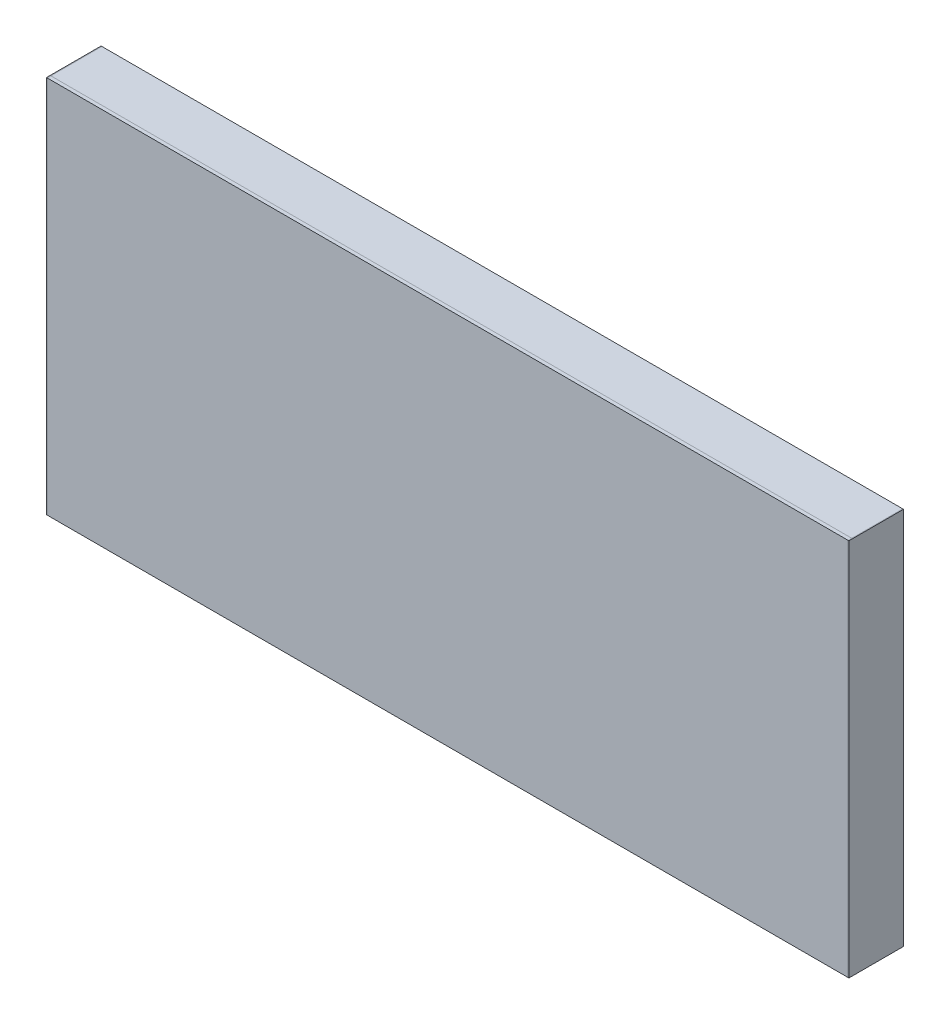
ISO-10303-21;
HEADER;
FILE_DESCRIPTION(('STEP AP214'),'2;1');
FILE_NAME('part.step','',(''),(''),'','','');
FILE_SCHEMA(('AUTOMOTIVE_DESIGN { 1 0 10303 214 1 1 1 1 }'));
ENDSEC;
DATA;
#1=APPLICATION_CONTEXT('core data for automotive mechanical design processes');
#2=APPLICATION_PROTOCOL_DEFINITION('international standard','automotive_design',2000,#1);
#3=PRODUCT_CONTEXT('',#1,'mechanical');
#4=PRODUCT('Part','Part','',(#3));
#5=PRODUCT_RELATED_PRODUCT_CATEGORY('part','',(#4));
#6=PRODUCT_DEFINITION_FORMATION('','',#4);
#7=PRODUCT_DEFINITION_CONTEXT('part definition',#1,'design');
#8=PRODUCT_DEFINITION('design','',#6,#7);
#9=PRODUCT_DEFINITION_SHAPE('','',#8);
#10=(LENGTH_UNIT() NAMED_UNIT(*) SI_UNIT(.MILLI.,.METRE.));
#11=(NAMED_UNIT(*) PLANE_ANGLE_UNIT() SI_UNIT($,.RADIAN.));
#12=(NAMED_UNIT(*) SI_UNIT($,.STERADIAN.) SOLID_ANGLE_UNIT());
#13=UNCERTAINTY_MEASURE_WITH_UNIT(LENGTH_MEASURE(1.E-05),#10,'distance_accuracy_value','');
#14=(GEOMETRIC_REPRESENTATION_CONTEXT(3) GLOBAL_UNCERTAINTY_ASSIGNED_CONTEXT((#13)) GLOBAL_UNIT_ASSIGNED_CONTEXT((#10,
#11,#12)) REPRESENTATION_CONTEXT('',''));
#15=CARTESIAN_POINT('',(0.,0.,0.));
#16=DIRECTION('',(0.,0.,1.));
#17=DIRECTION('',(1.,0.,0.));
#18=AXIS2_PLACEMENT_3D('',#15,#16,#17);
#19=CARTESIAN_POINT('',(-330.6,132.,-42.));
#20=DIRECTION('',(0.,0.,1.));
#21=DIRECTION('',(-1.,0.,0.));
#22=AXIS2_PLACEMENT_3D('',#19,#20,#21);
#23=PLANE('',#22);
#24=DIRECTION('',(0.,1.,0.));
#25=VECTOR('',#24,1.);
#26=CARTESIAN_POINT('',(-330.,132.,-42.));
#27=LINE('',#26,#25);
#28=CARTESIAN_POINT('',(-330.,-156.,-42.));
#29=VERTEX_POINT('',#28);
#30=CARTESIAN_POINT('',(-330.,156.,-42.));
#31=VERTEX_POINT('',#30);
#32=EDGE_CURVE('E114',#29,#31,#27,.T.);
#33=ORIENTED_EDGE('',*,*,#32,.F.);
#34=DIRECTION('',(1.,0.,0.));
#35=VECTOR('',#34,1.);
#36=CARTESIAN_POINT('',(-330.6,-156.,-42.));
#37=LINE('',#36,#35);
#38=CARTESIAN_POINT('',(-330.6,-156.,-42.));
#39=VERTEX_POINT('',#38);
#40=EDGE_CURVE('E112',#39,#29,#37,.T.);
#41=ORIENTED_EDGE('',*,*,#40,.F.);
#42=DIRECTION('',(0.,1.,0.));
#43=VECTOR('',#42,1.);
#44=CARTESIAN_POINT('',(-330.6,-156.,-42.));
#45=LINE('',#44,#43);
#46=CARTESIAN_POINT('',(-330.6,156.,-42.));
#47=VERTEX_POINT('',#46);
#48=EDGE_CURVE('E107',#39,#47,#45,.T.);
#49=ORIENTED_EDGE('',*,*,#48,.T.);
#50=DIRECTION('',(1.,0.,0.));
#51=VECTOR('',#50,1.);
#52=CARTESIAN_POINT('',(-330.6,156.,-42.));
#53=LINE('',#52,#51);
#54=EDGE_CURVE('E12',#47,#31,#53,.T.);
#55=ORIENTED_EDGE('',*,*,#54,.T.);
#56=EDGE_LOOP('',(#33,#41,#49,#55));
#57=FACE_BOUND('',#56,.T.);
#58=ADVANCED_FACE('F55',(#57),#23,.F.);
#59=CARTESIAN_POINT('',(-330.6,156.,3.));
#60=DIRECTION('',(0.,1.,0.));
#61=DIRECTION('',(0.,0.,1.));
#62=AXIS2_PLACEMENT_3D('',#59,#60,#61);
#63=PLANE('',#62);
#64=DIRECTION('',(0.,0.,-1.));
#65=VECTOR('',#64,1.);
#66=CARTESIAN_POINT('',(-330.,156.,3.));
#67=LINE('',#66,#65);
#68=CARTESIAN_POINT('',(-330.,156.,3.));
#69=VERTEX_POINT('',#68);
#70=EDGE_CURVE('E120',#69,#31,#67,.T.);
#71=ORIENTED_EDGE('',*,*,#70,.T.);
#72=ORIENTED_EDGE('',*,*,#54,.F.);
#73=DIRECTION('',(0.,0.,-1.));
#74=VECTOR('',#73,1.);
#75=CARTESIAN_POINT('',(-330.6,156.,0.));
#76=LINE('',#75,#74);
#77=CARTESIAN_POINT('',(-330.6,156.,3.));
#78=VERTEX_POINT('',#77);
#79=EDGE_CURVE('E93',#78,#47,#76,.T.);
#80=ORIENTED_EDGE('',*,*,#79,.F.);
#81=DIRECTION('',(1.,0.,0.));
#82=VECTOR('',#81,1.);
#83=CARTESIAN_POINT('',(-330.6,156.,3.));
#84=LINE('',#83,#82);
#85=EDGE_CURVE('E58',#78,#69,#84,.T.);
#86=ORIENTED_EDGE('',*,*,#85,.T.);
#87=EDGE_LOOP('',(#71,#72,#80,#86));
#88=FACE_BOUND('',#87,.T.);
#89=ADVANCED_FACE('F110',(#88),#63,.T.);
#90=CARTESIAN_POINT('',(-330.6,-156.,3.));
#91=DIRECTION('',(0.,0.,1.));
#92=DIRECTION('',(-1.,0.,0.));
#93=AXIS2_PLACEMENT_3D('',#90,#91,#92);
#94=PLANE('',#93);
#95=DIRECTION('',(0.,1.,0.));
#96=VECTOR('',#95,1.);
#97=CARTESIAN_POINT('',(-330.,-156.,3.));
#98=LINE('',#97,#96);
#99=CARTESIAN_POINT('',(-330.,-156.,3.));
#100=VERTEX_POINT('',#99);
#101=EDGE_CURVE('E101',#100,#69,#98,.T.);
#102=ORIENTED_EDGE('',*,*,#101,.T.);
#103=ORIENTED_EDGE('',*,*,#85,.F.);
#104=DIRECTION('',(0.,1.,0.));
#105=VECTOR('',#104,1.);
#106=CARTESIAN_POINT('',(-330.6,-156.,3.));
#107=LINE('',#106,#105);
#108=CARTESIAN_POINT('',(-330.6,-156.,3.));
#109=VERTEX_POINT('',#108);
#110=EDGE_CURVE('E98',#109,#78,#107,.T.);
#111=ORIENTED_EDGE('',*,*,#110,.F.);
#112=DIRECTION('',(1.,0.,0.));
#113=VECTOR('',#112,1.);
#114=CARTESIAN_POINT('',(-330.6,-156.,3.));
#115=LINE('',#114,#113);
#116=EDGE_CURVE('E106',#109,#100,#115,.T.);
#117=ORIENTED_EDGE('',*,*,#116,.T.);
#118=EDGE_LOOP('',(#102,#103,#111,#117));
#119=FACE_BOUND('',#118,.T.);
#120=ADVANCED_FACE('F105',(#119),#94,.T.);
#121=CARTESIAN_POINT('',(-330.6,-156.,3.));
#122=DIRECTION('',(0.,1.,0.));
#123=DIRECTION('',(0.,0.,1.));
#124=AXIS2_PLACEMENT_3D('',#121,#122,#123);
#125=PLANE('',#124);
#126=DIRECTION('',(0.,0.,-1.));
#127=VECTOR('',#126,1.);
#128=CARTESIAN_POINT('',(-330.,-156.,3.));
#129=LINE('',#128,#127);
#130=EDGE_CURVE('E81',#100,#29,#129,.T.);
#131=ORIENTED_EDGE('',*,*,#130,.F.);
#132=ORIENTED_EDGE('',*,*,#116,.F.);
#133=DIRECTION('',(0.,0.,-1.));
#134=VECTOR('',#133,1.);
#135=CARTESIAN_POINT('',(-330.6,-156.,3.));
#136=LINE('',#135,#134);
#137=EDGE_CURVE('E67',#109,#39,#136,.T.);
#138=ORIENTED_EDGE('',*,*,#137,.T.);
#139=ORIENTED_EDGE('',*,*,#40,.T.);
#140=EDGE_LOOP('',(#131,#132,#138,#139));
#141=FACE_BOUND('',#140,.T.);
#142=ADVANCED_FACE('F129',(#141),#125,.F.);
#143=CARTESIAN_POINT('',(-330.6,0.,0.));
#144=DIRECTION('',(1.,0.,0.));
#145=DIRECTION('',(0.,0.,1.));
#146=AXIS2_PLACEMENT_3D('',#143,#144,#145);
#147=PLANE('',#146);
#148=ORIENTED_EDGE('',*,*,#48,.F.);
#149=ORIENTED_EDGE('',*,*,#137,.F.);
#150=ORIENTED_EDGE('',*,*,#110,.T.);
#151=ORIENTED_EDGE('',*,*,#79,.T.);
#152=EDGE_LOOP('',(#148,#149,#150,#151));
#153=FACE_BOUND('',#152,.T.);
#154=ADVANCED_FACE('F96',(#153),#147,.F.);
#155=CARTESIAN_POINT('',(-330.,0.,0.));
#156=DIRECTION('',(1.,0.,0.));
#157=DIRECTION('',(0.,0.,1.));
#158=AXIS2_PLACEMENT_3D('',#155,#156,#157);
#159=PLANE('',#158);
#160=ORIENTED_EDGE('',*,*,#32,.T.);
#161=ORIENTED_EDGE('',*,*,#70,.F.);
#162=ORIENTED_EDGE('',*,*,#101,.F.);
#163=ORIENTED_EDGE('',*,*,#130,.T.);
#164=EDGE_LOOP('',(#160,#161,#162,#163));
#165=FACE_BOUND('',#164,.T.);
#166=ADVANCED_FACE('F125',(#165),#159,.T.);
#167=CLOSED_SHELL('',(#58,#89,#120,#142,#154,#166));
#168=MANIFOLD_SOLID_BREP('B2',#167);
#169=CARTESIAN_POINT('',(330.,-156.,3.));
#170=DIRECTION('',(-1.,0.,0.));
#171=DIRECTION('',(0.,0.,1.));
#172=AXIS2_PLACEMENT_3D('',#169,#170,#171);
#173=PLANE('',#172);
#174=DIRECTION('',(0.,0.,-1.));
#175=VECTOR('',#174,1.);
#176=CARTESIAN_POINT('',(330.,-156.,3.));
#177=LINE('',#176,#175);
#178=CARTESIAN_POINT('',(330.,-156.,3.));
#179=VERTEX_POINT('',#178);
#180=CARTESIAN_POINT('',(330.,-156.,-42.));
#181=VERTEX_POINT('',#180);
#182=EDGE_CURVE('E265',#179,#181,#177,.T.);
#183=ORIENTED_EDGE('',*,*,#182,.T.);
#184=DIRECTION('',(0.,1.,0.));
#185=VECTOR('',#184,1.);
#186=CARTESIAN_POINT('',(330.,-156.,-42.));
#187=LINE('',#186,#185);
#188=CARTESIAN_POINT('',(330.,-132.,-42.));
#189=VERTEX_POINT('',#188);
#190=EDGE_CURVE('E278',#181,#189,#187,.T.);
#191=ORIENTED_EDGE('',*,*,#190,.T.);
#192=DIRECTION('',(0.,0.,-1.));
#193=VECTOR('',#192,1.);
#194=CARTESIAN_POINT('',(330.,-132.,-42.));
#195=LINE('',#194,#193);
#196=CARTESIAN_POINT('',(330.,-132.,-40.8));
#197=VERTEX_POINT('',#196);
#198=EDGE_CURVE('E311',#197,#189,#195,.T.);
#199=ORIENTED_EDGE('',*,*,#198,.F.);
#200=DIRECTION('',(0.,1.,0.));
#201=VECTOR('',#200,1.);
#202=CARTESIAN_POINT('',(330.,-156.,-40.8));
#203=LINE('',#202,#201);
#204=CARTESIAN_POINT('',(330.,-154.8,-40.8));
#205=VERTEX_POINT('',#204);
#206=EDGE_CURVE('E291',#205,#197,#203,.T.);
#207=ORIENTED_EDGE('',*,*,#206,.F.);
#208=DIRECTION('',(0.,0.,-1.));
#209=VECTOR('',#208,1.);
#210=CARTESIAN_POINT('',(330.,-154.8,0.));
#211=LINE('',#210,#209);
#212=CARTESIAN_POINT('',(330.,-154.8,0.));
#213=VERTEX_POINT('',#212);
#214=EDGE_CURVE('E290',#213,#205,#211,.T.);
#215=ORIENTED_EDGE('',*,*,#214,.F.);
#216=DIRECTION('',(0.,1.,0.));
#217=VECTOR('',#216,1.);
#218=CARTESIAN_POINT('',(330.,-156.,0.));
#219=LINE('',#218,#217);
#220=CARTESIAN_POINT('',(330.,156.,0.));
#221=VERTEX_POINT('',#220);
#222=EDGE_CURVE('E313',#213,#221,#219,.T.);
#223=ORIENTED_EDGE('',*,*,#222,.T.);
#224=DIRECTION('',(0.,0.,-1.));
#225=VECTOR('',#224,1.);
#226=CARTESIAN_POINT('',(330.,156.,3.));
#227=LINE('',#226,#225);
#228=CARTESIAN_POINT('',(330.,156.,3.));
#229=VERTEX_POINT('',#228);
#230=EDGE_CURVE('E49',#229,#221,#227,.T.);
#231=ORIENTED_EDGE('',*,*,#230,.F.);
#232=DIRECTION('',(0.,1.,0.));
#233=VECTOR('',#232,1.);
#234=CARTESIAN_POINT('',(330.,-156.,3.));
#235=LINE('',#234,#233);
#236=EDGE_CURVE('E314',#179,#229,#235,.T.);
#237=ORIENTED_EDGE('',*,*,#236,.F.);
#238=EDGE_LOOP('',(#183,#191,#199,#207,#215,#223,#231,#237));
#239=FACE_BOUND('',#238,.T.);
#240=ADVANCED_FACE('F182',(#239),#173,.F.);
#241=CARTESIAN_POINT('',(-330.,156.,3.));
#242=DIRECTION('',(0.,-1.,0.));
#243=DIRECTION('',(0.,0.,-1.));
#244=AXIS2_PLACEMENT_3D('',#241,#242,#243);
#245=PLANE('',#244);
#246=DIRECTION('',(-1.,0.,0.));
#247=VECTOR('',#246,1.);
#248=CARTESIAN_POINT('',(-330.,156.,0.));
#249=LINE('',#248,#247);
#250=CARTESIAN_POINT('',(-330.,156.,0.));
#251=VERTEX_POINT('',#250);
#252=EDGE_CURVE('E223',#221,#251,#249,.T.);
#253=ORIENTED_EDGE('',*,*,#252,.T.);
#254=DIRECTION('',(0.,0.,-1.));
#255=VECTOR('',#254,1.);
#256=CARTESIAN_POINT('',(-330.,156.,3.));
#257=LINE('',#256,#255);
#258=CARTESIAN_POINT('',(-330.,156.,3.));
#259=VERTEX_POINT('',#258);
#260=EDGE_CURVE('E191',#259,#251,#257,.T.);
#261=ORIENTED_EDGE('',*,*,#260,.F.);
#262=DIRECTION('',(-1.,0.,0.));
#263=VECTOR('',#262,1.);
#264=CARTESIAN_POINT('',(-330.,156.,3.));
#265=LINE('',#264,#263);
#266=EDGE_CURVE('E226',#229,#259,#265,.T.);
#267=ORIENTED_EDGE('',*,*,#266,.F.);
#268=ORIENTED_EDGE('',*,*,#230,.T.);
#269=EDGE_LOOP('',(#253,#261,#267,#268));
#270=FACE_BOUND('',#269,.T.);
#271=ADVANCED_FACE('F335',(#270),#245,.F.);
#272=CARTESIAN_POINT('',(-330.,-156.,3.));
#273=DIRECTION('',(1.,0.,0.));
#274=DIRECTION('',(0.,0.,-1.));
#275=AXIS2_PLACEMENT_3D('',#272,#273,#274);
#276=PLANE('',#275);
#277=DIRECTION('',(0.,-1.,0.));
#278=VECTOR('',#277,1.);
#279=CARTESIAN_POINT('',(-330.,-156.,0.));
#280=LINE('',#279,#278);
#281=CARTESIAN_POINT('',(-330.,-154.8,0.));
#282=VERTEX_POINT('',#281);
#283=EDGE_CURVE('E320',#251,#282,#280,.T.);
#284=ORIENTED_EDGE('',*,*,#283,.T.);
#285=DIRECTION('',(0.,0.,-1.));
#286=VECTOR('',#285,1.);
#287=CARTESIAN_POINT('',(-330.,-154.8,0.));
#288=LINE('',#287,#286);
#289=CARTESIAN_POINT('',(-330.,-154.8,-40.8));
#290=VERTEX_POINT('',#289);
#291=EDGE_CURVE('E283',#282,#290,#288,.T.);
#292=ORIENTED_EDGE('',*,*,#291,.T.);
#293=DIRECTION('',(0.,1.,0.));
#294=VECTOR('',#293,1.);
#295=CARTESIAN_POINT('',(-330.,-156.,-40.8));
#296=LINE('',#295,#294);
#297=CARTESIAN_POINT('',(-330.,-132.,-40.8));
#298=VERTEX_POINT('',#297);
#299=EDGE_CURVE('E288',#290,#298,#296,.T.);
#300=ORIENTED_EDGE('',*,*,#299,.T.);
#301=DIRECTION('',(0.,0.,-1.));
#302=VECTOR('',#301,1.);
#303=CARTESIAN_POINT('',(-330.,-132.,-42.));
#304=LINE('',#303,#302);
#305=CARTESIAN_POINT('',(-330.,-132.,-42.));
#306=VERTEX_POINT('',#305);
#307=EDGE_CURVE('E266',#298,#306,#304,.T.);
#308=ORIENTED_EDGE('',*,*,#307,.T.);
#309=DIRECTION('',(0.,1.,0.));
#310=VECTOR('',#309,1.);
#311=CARTESIAN_POINT('',(-330.,-156.,-42.));
#312=LINE('',#311,#310);
#313=CARTESIAN_POINT('',(-330.,-156.,-42.));
#314=VERTEX_POINT('',#313);
#315=EDGE_CURVE('E270',#314,#306,#312,.T.);
#316=ORIENTED_EDGE('',*,*,#315,.F.);
#317=DIRECTION('',(0.,0.,-1.));
#318=VECTOR('',#317,1.);
#319=CARTESIAN_POINT('',(-330.,-156.,3.));
#320=LINE('',#319,#318);
#321=CARTESIAN_POINT('',(-330.,-156.,3.));
#322=VERTEX_POINT('',#321);
#323=EDGE_CURVE('E256',#322,#314,#320,.T.);
#324=ORIENTED_EDGE('',*,*,#323,.F.);
#325=DIRECTION('',(0.,-1.,0.));
#326=VECTOR('',#325,1.);
#327=CARTESIAN_POINT('',(-330.,-156.,3.));
#328=LINE('',#327,#326);
#329=EDGE_CURVE('E316',#259,#322,#328,.T.);
#330=ORIENTED_EDGE('',*,*,#329,.F.);
#331=ORIENTED_EDGE('',*,*,#260,.T.);
#332=EDGE_LOOP('',(#284,#292,#300,#308,#316,#324,#330,#331));
#333=FACE_BOUND('',#332,.T.);
#334=ADVANCED_FACE('F268',(#333),#276,.F.);
#335=CARTESIAN_POINT('',(-330.,-156.,3.));
#336=DIRECTION('',(0.,1.,0.));
#337=DIRECTION('',(0.,0.,1.));
#338=AXIS2_PLACEMENT_3D('',#335,#336,#337);
#339=PLANE('',#338);
#340=ORIENTED_EDGE('',*,*,#323,.T.);
#341=DIRECTION('',(1.,0.,0.));
#342=VECTOR('',#341,1.);
#343=CARTESIAN_POINT('',(-330.,-156.,-42.));
#344=LINE('',#343,#342);
#345=EDGE_CURVE('E263',#314,#181,#344,.T.);
#346=ORIENTED_EDGE('',*,*,#345,.T.);
#347=ORIENTED_EDGE('',*,*,#182,.F.);
#348=DIRECTION('',(1.,0.,0.));
#349=VECTOR('',#348,1.);
#350=CARTESIAN_POINT('',(-330.,-156.,3.));
#351=LINE('',#350,#349);
#352=EDGE_CURVE('E206',#322,#179,#351,.T.);
#353=ORIENTED_EDGE('',*,*,#352,.F.);
#354=EDGE_LOOP('',(#340,#346,#347,#353));
#355=FACE_BOUND('',#354,.T.);
#356=ADVANCED_FACE('F258',(#355),#339,.F.);
#357=CARTESIAN_POINT('',(0.,0.,3.));
#358=DIRECTION('',(0.,0.,-1.));
#359=DIRECTION('',(-1.,0.,0.));
#360=AXIS2_PLACEMENT_3D('',#357,#358,#359);
#361=PLANE('',#360);
#362=ORIENTED_EDGE('',*,*,#236,.T.);
#363=ORIENTED_EDGE('',*,*,#266,.T.);
#364=ORIENTED_EDGE('',*,*,#329,.T.);
#365=ORIENTED_EDGE('',*,*,#352,.T.);
#366=EDGE_LOOP('',(#362,#363,#364,#365));
#367=FACE_BOUND('',#366,.T.);
#368=ADVANCED_FACE('F355',(#367),#361,.F.);
#369=CARTESIAN_POINT('',(0.,0.,0.));
#370=DIRECTION('',(0.,0.,-1.));
#371=DIRECTION('',(-1.,0.,0.));
#372=AXIS2_PLACEMENT_3D('',#369,#370,#371);
#373=PLANE('',#372);
#374=DIRECTION('',(1.,0.,0.));
#375=VECTOR('',#374,1.);
#376=CARTESIAN_POINT('',(-330.,-154.8,0.));
#377=LINE('',#376,#375);
#378=EDGE_CURVE('E187',#282,#213,#377,.T.);
#379=ORIENTED_EDGE('',*,*,#378,.F.);
#380=ORIENTED_EDGE('',*,*,#283,.F.);
#381=ORIENTED_EDGE('',*,*,#252,.F.);
#382=ORIENTED_EDGE('',*,*,#222,.F.);
#383=EDGE_LOOP('',(#379,#380,#381,#382));
#384=FACE_BOUND('',#383,.T.);
#385=ADVANCED_FACE('F326',(#384),#373,.T.);
#386=CARTESIAN_POINT('',(-330.,-132.,-42.));
#387=DIRECTION('',(0.,1.,0.));
#388=DIRECTION('',(1.,0.,0.));
#389=AXIS2_PLACEMENT_3D('',#386,#387,#388);
#390=PLANE('',#389);
#391=ORIENTED_EDGE('',*,*,#307,.F.);
#392=DIRECTION('',(-1.,0.,0.));
#393=VECTOR('',#392,1.);
#394=CARTESIAN_POINT('',(-330.,-132.,-40.8));
#395=LINE('',#394,#393);
#396=EDGE_CURVE('E281',#298,#197,#395,.F.);
#397=ORIENTED_EDGE('',*,*,#396,.T.);
#398=ORIENTED_EDGE('',*,*,#198,.T.);
#399=DIRECTION('',(1.,0.,0.));
#400=VECTOR('',#399,1.);
#401=CARTESIAN_POINT('',(-330.,-132.,-42.));
#402=LINE('',#401,#400);
#403=EDGE_CURVE('E274',#306,#189,#402,.T.);
#404=ORIENTED_EDGE('',*,*,#403,.F.);
#405=EDGE_LOOP('',(#391,#397,#398,#404));
#406=FACE_BOUND('',#405,.T.);
#407=ADVANCED_FACE('F343',(#406),#390,.T.);
#408=CARTESIAN_POINT('',(-330.,-156.,-42.));
#409=DIRECTION('',(0.,0.,-1.));
#410=DIRECTION('',(-1.,0.,0.));
#411=AXIS2_PLACEMENT_3D('',#408,#409,#410);
#412=PLANE('',#411);
#413=ORIENTED_EDGE('',*,*,#190,.F.);
#414=ORIENTED_EDGE('',*,*,#345,.F.);
#415=ORIENTED_EDGE('',*,*,#315,.T.);
#416=ORIENTED_EDGE('',*,*,#403,.T.);
#417=EDGE_LOOP('',(#413,#414,#415,#416));
#418=FACE_BOUND('',#417,.T.);
#419=ADVANCED_FACE('F276',(#418),#412,.T.);
#420=CARTESIAN_POINT('',(-330.,-154.8,0.));
#421=DIRECTION('',(0.,-1.,0.));
#422=DIRECTION('',(0.,0.,-1.));
#423=AXIS2_PLACEMENT_3D('',#420,#421,#422);
#424=PLANE('',#423);
#425=ORIENTED_EDGE('',*,*,#214,.T.);
#426=DIRECTION('',(1.,0.,0.));
#427=VECTOR('',#426,1.);
#428=CARTESIAN_POINT('',(-330.,-154.8,-40.8));
#429=LINE('',#428,#427);
#430=EDGE_CURVE('E293',#290,#205,#429,.T.);
#431=ORIENTED_EDGE('',*,*,#430,.F.);
#432=ORIENTED_EDGE('',*,*,#291,.F.);
#433=ORIENTED_EDGE('',*,*,#378,.T.);
#434=EDGE_LOOP('',(#425,#431,#432,#433));
#435=FACE_BOUND('',#434,.T.);
#436=ADVANCED_FACE('F336',(#435),#424,.F.);
#437=CARTESIAN_POINT('',(-330.,-156.,-40.8));
#438=DIRECTION('',(0.,0.,-1.));
#439=DIRECTION('',(-1.,0.,0.));
#440=AXIS2_PLACEMENT_3D('',#437,#438,#439);
#441=PLANE('',#440);
#442=ORIENTED_EDGE('',*,*,#206,.T.);
#443=ORIENTED_EDGE('',*,*,#396,.F.);
#444=ORIENTED_EDGE('',*,*,#299,.F.);
#445=ORIENTED_EDGE('',*,*,#430,.T.);
#446=EDGE_LOOP('',(#442,#443,#444,#445));
#447=FACE_BOUND('',#446,.T.);
#448=ADVANCED_FACE('F341',(#447),#441,.F.);
#449=CLOSED_SHELL('',(#240,#271,#334,#356,#368,#385,#407,#419,#436,#448));
#450=MANIFOLD_SOLID_BREP('B6',#449);
#451=CARTESIAN_POINT('',(330.6,132.,-42.));
#452=DIRECTION('',(0.,0.,1.));
#453=DIRECTION('',(1.,0.,0.));
#454=AXIS2_PLACEMENT_3D('',#451,#452,#453);
#455=PLANE('',#454);
#456=DIRECTION('',(0.,1.,0.));
#457=VECTOR('',#456,1.);
#458=CARTESIAN_POINT('',(330.,132.,-42.));
#459=LINE('',#458,#457);
#460=CARTESIAN_POINT('',(330.,-156.,-42.));
#461=VERTEX_POINT('',#460);
#462=CARTESIAN_POINT('',(330.,156.,-42.));
#463=VERTEX_POINT('',#462);
#464=EDGE_CURVE('E469',#461,#463,#459,.T.);
#465=ORIENTED_EDGE('',*,*,#464,.T.);
#466=DIRECTION('',(-1.,0.,0.));
#467=VECTOR('',#466,1.);
#468=CARTESIAN_POINT('',(330.6,156.,-42.));
#469=LINE('',#468,#467);
#470=CARTESIAN_POINT('',(330.6,156.,-42.));
#471=VERTEX_POINT('',#470);
#472=EDGE_CURVE('E181',#471,#463,#469,.T.);
#473=ORIENTED_EDGE('',*,*,#472,.F.);
#474=DIRECTION('',(0.,1.,0.));
#475=VECTOR('',#474,1.);
#476=CARTESIAN_POINT('',(330.6,-156.,-42.));
#477=LINE('',#476,#475);
#478=CARTESIAN_POINT('',(330.6,-156.,-42.));
#479=VERTEX_POINT('',#478);
#480=EDGE_CURVE('E475',#479,#471,#477,.T.);
#481=ORIENTED_EDGE('',*,*,#480,.F.);
#482=DIRECTION('',(-1.,0.,0.));
#483=VECTOR('',#482,1.);
#484=CARTESIAN_POINT('',(330.6,-156.,-42.));
#485=LINE('',#484,#483);
#486=EDGE_CURVE('E493',#479,#461,#485,.T.);
#487=ORIENTED_EDGE('',*,*,#486,.T.);
#488=EDGE_LOOP('',(#465,#473,#481,#487));
#489=FACE_BOUND('',#488,.T.);
#490=ADVANCED_FACE('F431',(#489),#455,.F.);
#491=CARTESIAN_POINT('',(330.6,156.,3.));
#492=DIRECTION('',(0.,1.,0.));
#493=DIRECTION('',(0.,0.,1.));
#494=AXIS2_PLACEMENT_3D('',#491,#492,#493);
#495=PLANE('',#494);
#496=DIRECTION('',(0.,0.,-1.));
#497=VECTOR('',#496,1.);
#498=CARTESIAN_POINT('',(330.,156.,3.));
#499=LINE('',#498,#497);
#500=CARTESIAN_POINT('',(330.,156.,3.));
#501=VERTEX_POINT('',#500);
#502=EDGE_CURVE('E481',#501,#463,#499,.T.);
#503=ORIENTED_EDGE('',*,*,#502,.F.);
#504=DIRECTION('',(-1.,0.,0.));
#505=VECTOR('',#504,1.);
#506=CARTESIAN_POINT('',(330.6,156.,3.));
#507=LINE('',#506,#505);
#508=CARTESIAN_POINT('',(330.6,156.,3.));
#509=VERTEX_POINT('',#508);
#510=EDGE_CURVE('E437',#509,#501,#507,.T.);
#511=ORIENTED_EDGE('',*,*,#510,.F.);
#512=DIRECTION('',(0.,0.,-1.));
#513=VECTOR('',#512,1.);
#514=CARTESIAN_POINT('',(330.6,156.,0.));
#515=LINE('',#514,#513);
#516=EDGE_CURVE('E478',#509,#471,#515,.T.);
#517=ORIENTED_EDGE('',*,*,#516,.T.);
#518=ORIENTED_EDGE('',*,*,#472,.T.);
#519=EDGE_LOOP('',(#503,#511,#517,#518));
#520=FACE_BOUND('',#519,.T.);
#521=ADVANCED_FACE('F484',(#520),#495,.T.);
#522=CARTESIAN_POINT('',(330.6,-156.,3.));
#523=DIRECTION('',(0.,0.,1.));
#524=DIRECTION('',(1.,0.,0.));
#525=AXIS2_PLACEMENT_3D('',#522,#523,#524);
#526=PLANE('',#525);
#527=DIRECTION('',(0.,1.,0.));
#528=VECTOR('',#527,1.);
#529=CARTESIAN_POINT('',(330.,-156.,3.));
#530=LINE('',#529,#528);
#531=CARTESIAN_POINT('',(330.,-156.,3.));
#532=VERTEX_POINT('',#531);
#533=EDGE_CURVE('E500',#532,#501,#530,.T.);
#534=ORIENTED_EDGE('',*,*,#533,.F.);
#535=DIRECTION('',(-1.,0.,0.));
#536=VECTOR('',#535,1.);
#537=CARTESIAN_POINT('',(330.6,-156.,3.));
#538=LINE('',#537,#536);
#539=CARTESIAN_POINT('',(330.6,-156.,3.));
#540=VERTEX_POINT('',#539);
#541=EDGE_CURVE('E463',#540,#532,#538,.T.);
#542=ORIENTED_EDGE('',*,*,#541,.F.);
#543=DIRECTION('',(0.,1.,0.));
#544=VECTOR('',#543,1.);
#545=CARTESIAN_POINT('',(330.6,-156.,3.));
#546=LINE('',#545,#544);
#547=EDGE_CURVE('E476',#540,#509,#546,.T.);
#548=ORIENTED_EDGE('',*,*,#547,.T.);
#549=ORIENTED_EDGE('',*,*,#510,.T.);
#550=EDGE_LOOP('',(#534,#542,#548,#549));
#551=FACE_BOUND('',#550,.T.);
#552=ADVANCED_FACE('F490',(#551),#526,.T.);
#553=CARTESIAN_POINT('',(330.6,-156.,3.));
#554=DIRECTION('',(0.,1.,0.));
#555=DIRECTION('',(0.,0.,1.));
#556=AXIS2_PLACEMENT_3D('',#553,#554,#555);
#557=PLANE('',#556);
#558=DIRECTION('',(0.,0.,-1.));
#559=VECTOR('',#558,1.);
#560=CARTESIAN_POINT('',(330.,-156.,3.));
#561=LINE('',#560,#559);
#562=EDGE_CURVE('E497',#532,#461,#561,.T.);
#563=ORIENTED_EDGE('',*,*,#562,.T.);
#564=ORIENTED_EDGE('',*,*,#486,.F.);
#565=DIRECTION('',(0.,0.,-1.));
#566=VECTOR('',#565,1.);
#567=CARTESIAN_POINT('',(330.6,-156.,3.));
#568=LINE('',#567,#566);
#569=EDGE_CURVE('E450',#540,#479,#568,.T.);
#570=ORIENTED_EDGE('',*,*,#569,.F.);
#571=ORIENTED_EDGE('',*,*,#541,.T.);
#572=EDGE_LOOP('',(#563,#564,#570,#571));
#573=FACE_BOUND('',#572,.T.);
#574=ADVANCED_FACE('F502',(#573),#557,.F.);
#575=CARTESIAN_POINT('',(330.6,0.,0.));
#576=DIRECTION('',(-1.,0.,0.));
#577=DIRECTION('',(0.,0.,1.));
#578=AXIS2_PLACEMENT_3D('',#575,#576,#577);
#579=PLANE('',#578);
#580=ORIENTED_EDGE('',*,*,#480,.T.);
#581=ORIENTED_EDGE('',*,*,#516,.F.);
#582=ORIENTED_EDGE('',*,*,#547,.F.);
#583=ORIENTED_EDGE('',*,*,#569,.T.);
#584=EDGE_LOOP('',(#580,#581,#582,#583));
#585=FACE_BOUND('',#584,.T.);
#586=ADVANCED_FACE('F477',(#585),#579,.F.);
#587=CARTESIAN_POINT('',(330.,0.,0.));
#588=DIRECTION('',(-1.,0.,0.));
#589=DIRECTION('',(0.,0.,1.));
#590=AXIS2_PLACEMENT_3D('',#587,#588,#589);
#591=PLANE('',#590);
#592=ORIENTED_EDGE('',*,*,#464,.F.);
#593=ORIENTED_EDGE('',*,*,#562,.F.);
#594=ORIENTED_EDGE('',*,*,#533,.T.);
#595=ORIENTED_EDGE('',*,*,#502,.T.);
#596=EDGE_LOOP('',(#592,#593,#594,#595));
#597=FACE_BOUND('',#596,.T.);
#598=ADVANCED_FACE('F504',(#597),#591,.T.);
#599=CLOSED_SHELL('',(#490,#521,#552,#574,#586,#598));
#600=MANIFOLD_SOLID_BREP('B42',#599);
#601=CARTESIAN_POINT('',(-330.,156.,-42.));
#602=DIRECTION('',(-1.,0.,0.));
#603=DIRECTION('',(0.,-1.,0.));
#604=AXIS2_PLACEMENT_3D('',#601,#602,#603);
#605=PLANE('',#604);
#606=DIRECTION('',(0.,1.,0.));
#607=VECTOR('',#606,1.);
#608=CARTESIAN_POINT('',(-330.,156.,-40.8));
#609=LINE('',#608,#607);
#610=CARTESIAN_POINT('',(-330.,154.8,-40.8));
#611=VERTEX_POINT('',#610);
#612=CARTESIAN_POINT('',(-330.,132.,-40.8));
#613=VERTEX_POINT('',#612);
#614=EDGE_CURVE('E650',#611,#613,#609,.F.);
#615=ORIENTED_EDGE('',*,*,#614,.F.);
#616=DIRECTION('',(0.,0.,-1.));
#617=VECTOR('',#616,1.);
#618=CARTESIAN_POINT('',(-330.,154.8,0.));
#619=LINE('',#618,#617);
#620=CARTESIAN_POINT('',(-330.,154.8,0.));
#621=VERTEX_POINT('',#620);
#622=EDGE_CURVE('E645',#621,#611,#619,.T.);
#623=ORIENTED_EDGE('',*,*,#622,.F.);
#624=DIRECTION('',(0.,-1.,0.));
#625=VECTOR('',#624,1.);
#626=CARTESIAN_POINT('',(-330.,156.,0.));
#627=LINE('',#626,#625);
#628=CARTESIAN_POINT('',(-330.,156.,0.));
#629=VERTEX_POINT('',#628);
#630=EDGE_CURVE('E429',#629,#621,#627,.T.);
#631=ORIENTED_EDGE('',*,*,#630,.F.);
#632=DIRECTION('',(0.,0.,-1.));
#633=VECTOR('',#632,1.);
#634=CARTESIAN_POINT('',(-330.,156.,0.));
#635=LINE('',#634,#633);
#636=CARTESIAN_POINT('',(-330.,156.,-42.));
#637=VERTEX_POINT('',#636);
#638=EDGE_CURVE('E629',#629,#637,#635,.T.);
#639=ORIENTED_EDGE('',*,*,#638,.T.);
#640=DIRECTION('',(0.,-1.,0.));
#641=VECTOR('',#640,1.);
#642=CARTESIAN_POINT('',(-330.,156.,-42.));
#643=LINE('',#642,#641);
#644=CARTESIAN_POINT('',(-330.,132.,-42.));
#645=VERTEX_POINT('',#644);
#646=EDGE_CURVE('E625',#637,#645,#643,.T.);
#647=ORIENTED_EDGE('',*,*,#646,.T.);
#648=DIRECTION('',(0.,0.,1.));
#649=VECTOR('',#648,1.);
#650=CARTESIAN_POINT('',(-330.,132.,-42.));
#651=LINE('',#650,#649);
#652=EDGE_CURVE('E565',#645,#613,#651,.T.);
#653=ORIENTED_EDGE('',*,*,#652,.T.);
#654=EDGE_LOOP('',(#615,#623,#631,#639,#647,#653));
#655=FACE_BOUND('',#654,.T.);
#656=ADVANCED_FACE('F552',(#655),#605,.T.);
#657=CARTESIAN_POINT('',(-330.,132.,-42.));
#658=DIRECTION('',(0.,-1.,0.));
#659=DIRECTION('',(1.,0.,0.));
#660=AXIS2_PLACEMENT_3D('',#657,#658,#659);
#661=PLANE('',#660);
#662=ORIENTED_EDGE('',*,*,#652,.F.);
#663=DIRECTION('',(1.,0.,0.));
#664=VECTOR('',#663,1.);
#665=CARTESIAN_POINT('',(-330.,132.,-42.));
#666=LINE('',#665,#664);
#667=CARTESIAN_POINT('',(330.,132.,-42.));
#668=VERTEX_POINT('',#667);
#669=EDGE_CURVE('E616',#645,#668,#666,.T.);
#670=ORIENTED_EDGE('',*,*,#669,.T.);
#671=DIRECTION('',(0.,0.,1.));
#672=VECTOR('',#671,1.);
#673=CARTESIAN_POINT('',(330.,132.,-42.));
#674=LINE('',#673,#672);
#675=CARTESIAN_POINT('',(330.,132.,-40.8));
#676=VERTEX_POINT('',#675);
#677=EDGE_CURVE('E603',#668,#676,#674,.T.);
#678=ORIENTED_EDGE('',*,*,#677,.T.);
#679=DIRECTION('',(1.,0.,0.));
#680=VECTOR('',#679,1.);
#681=CARTESIAN_POINT('',(-330.,132.,-40.8));
#682=LINE('',#681,#680);
#683=EDGE_CURVE('E647',#613,#676,#682,.T.);
#684=ORIENTED_EDGE('',*,*,#683,.F.);
#685=EDGE_LOOP('',(#662,#670,#678,#684));
#686=FACE_BOUND('',#685,.T.);
#687=ADVANCED_FACE('F619',(#686),#661,.T.);
#688=CARTESIAN_POINT('',(330.,156.,0.));
#689=DIRECTION('',(-1.,0.,0.));
#690=DIRECTION('',(0.,0.,-1.));
#691=AXIS2_PLACEMENT_3D('',#688,#689,#690);
#692=PLANE('',#691);
#693=DIRECTION('',(0.,0.,-1.));
#694=VECTOR('',#693,1.);
#695=CARTESIAN_POINT('',(330.,154.8,0.));
#696=LINE('',#695,#694);
#697=CARTESIAN_POINT('',(330.,154.8,0.));
#698=VERTEX_POINT('',#697);
#699=CARTESIAN_POINT('',(330.,154.8,-40.8));
#700=VERTEX_POINT('',#699);
#701=EDGE_CURVE('E651',#698,#700,#696,.T.);
#702=ORIENTED_EDGE('',*,*,#701,.T.);
#703=DIRECTION('',(0.,1.,0.));
#704=VECTOR('',#703,1.);
#705=CARTESIAN_POINT('',(330.,156.,-40.8));
#706=LINE('',#705,#704);
#707=EDGE_CURVE('E606',#700,#676,#706,.F.);
#708=ORIENTED_EDGE('',*,*,#707,.T.);
#709=ORIENTED_EDGE('',*,*,#677,.F.);
#710=DIRECTION('',(0.,-1.,0.));
#711=VECTOR('',#710,1.);
#712=CARTESIAN_POINT('',(330.,156.,-42.));
#713=LINE('',#712,#711);
#714=CARTESIAN_POINT('',(330.,156.,-42.));
#715=VERTEX_POINT('',#714);
#716=EDGE_CURVE('E607',#715,#668,#713,.T.);
#717=ORIENTED_EDGE('',*,*,#716,.F.);
#718=DIRECTION('',(0.,0.,-1.));
#719=VECTOR('',#718,1.);
#720=CARTESIAN_POINT('',(330.,156.,0.));
#721=LINE('',#720,#719);
#722=CARTESIAN_POINT('',(330.,156.,0.));
#723=VERTEX_POINT('',#722);
#724=EDGE_CURVE('E623',#723,#715,#721,.T.);
#725=ORIENTED_EDGE('',*,*,#724,.F.);
#726=DIRECTION('',(0.,-1.,0.));
#727=VECTOR('',#726,1.);
#728=CARTESIAN_POINT('',(330.,156.,0.));
#729=LINE('',#728,#727);
#730=EDGE_CURVE('E558',#723,#698,#729,.T.);
#731=ORIENTED_EDGE('',*,*,#730,.T.);
#732=EDGE_LOOP('',(#702,#708,#709,#717,#725,#731));
#733=FACE_BOUND('',#732,.T.);
#734=ADVANCED_FACE('F608',(#733),#692,.F.);
#735=CARTESIAN_POINT('',(-330.,156.,0.));
#736=DIRECTION('',(0.,0.,-1.));
#737=DIRECTION('',(1.,0.,0.));
#738=AXIS2_PLACEMENT_3D('',#735,#736,#737);
#739=PLANE('',#738);
#740=DIRECTION('',(1.,0.,0.));
#741=VECTOR('',#740,1.);
#742=CARTESIAN_POINT('',(-330.,156.,0.));
#743=LINE('',#742,#741);
#744=EDGE_CURVE('E624',#629,#723,#743,.T.);
#745=ORIENTED_EDGE('',*,*,#744,.F.);
#746=ORIENTED_EDGE('',*,*,#630,.T.);
#747=DIRECTION('',(1.,0.,0.));
#748=VECTOR('',#747,1.);
#749=CARTESIAN_POINT('',(-330.,154.8,0.));
#750=LINE('',#749,#748);
#751=EDGE_CURVE('E643',#621,#698,#750,.T.);
#752=ORIENTED_EDGE('',*,*,#751,.T.);
#753=ORIENTED_EDGE('',*,*,#730,.F.);
#754=EDGE_LOOP('',(#745,#746,#752,#753));
#755=FACE_BOUND('',#754,.T.);
#756=ADVANCED_FACE('F555',(#755),#739,.F.);
#757=CARTESIAN_POINT('',(-330.,154.8,0.));
#758=DIRECTION('',(0.,-1.,0.));
#759=DIRECTION('',(0.,0.,-1.));
#760=AXIS2_PLACEMENT_3D('',#757,#758,#759);
#761=PLANE('',#760);
#762=ORIENTED_EDGE('',*,*,#701,.F.);
#763=ORIENTED_EDGE('',*,*,#751,.F.);
#764=ORIENTED_EDGE('',*,*,#622,.T.);
#765=DIRECTION('',(1.,0.,0.));
#766=VECTOR('',#765,1.);
#767=CARTESIAN_POINT('',(-330.,154.8,-40.8));
#768=LINE('',#767,#766);
#769=EDGE_CURVE('E640',#611,#700,#768,.T.);
#770=ORIENTED_EDGE('',*,*,#769,.T.);
#771=EDGE_LOOP('',(#762,#763,#764,#770));
#772=FACE_BOUND('',#771,.T.);
#773=ADVANCED_FACE('F667',(#772),#761,.T.);
#774=CARTESIAN_POINT('',(-330.,156.,-40.8));
#775=DIRECTION('',(0.,0.,1.));
#776=DIRECTION('',(1.,0.,0.));
#777=AXIS2_PLACEMENT_3D('',#774,#775,#776);
#778=PLANE('',#777);
#779=ORIENTED_EDGE('',*,*,#707,.F.);
#780=ORIENTED_EDGE('',*,*,#769,.F.);
#781=ORIENTED_EDGE('',*,*,#614,.T.);
#782=ORIENTED_EDGE('',*,*,#683,.T.);
#783=EDGE_LOOP('',(#779,#780,#781,#782));
#784=FACE_BOUND('',#783,.T.);
#785=ADVANCED_FACE('F664',(#784),#778,.T.);
#786=CARTESIAN_POINT('',(-330.,156.,0.));
#787=DIRECTION('',(0.,-1.,0.));
#788=DIRECTION('',(0.,0.,-1.));
#789=AXIS2_PLACEMENT_3D('',#786,#787,#788);
#790=PLANE('',#789);
#791=ORIENTED_EDGE('',*,*,#724,.T.);
#792=DIRECTION('',(1.,0.,0.));
#793=VECTOR('',#792,1.);
#794=CARTESIAN_POINT('',(-330.,156.,-42.));
#795=LINE('',#794,#793);
#796=EDGE_CURVE('E600',#637,#715,#795,.T.);
#797=ORIENTED_EDGE('',*,*,#796,.F.);
#798=ORIENTED_EDGE('',*,*,#638,.F.);
#799=ORIENTED_EDGE('',*,*,#744,.T.);
#800=EDGE_LOOP('',(#791,#797,#798,#799));
#801=FACE_BOUND('',#800,.T.);
#802=ADVANCED_FACE('F674',(#801),#790,.F.);
#803=CARTESIAN_POINT('',(-330.,156.,-42.));
#804=DIRECTION('',(0.,0.,1.));
#805=DIRECTION('',(1.,0.,0.));
#806=AXIS2_PLACEMENT_3D('',#803,#804,#805);
#807=PLANE('',#806);
#808=ORIENTED_EDGE('',*,*,#716,.T.);
#809=ORIENTED_EDGE('',*,*,#669,.F.);
#810=ORIENTED_EDGE('',*,*,#646,.F.);
#811=ORIENTED_EDGE('',*,*,#796,.T.);
#812=EDGE_LOOP('',(#808,#809,#810,#811));
#813=FACE_BOUND('',#812,.T.);
#814=ADVANCED_FACE('F617',(#813),#807,.F.);
#815=CLOSED_SHELL('',(#656,#687,#734,#756,#773,#785,#802,#814));
#816=MANIFOLD_SOLID_BREP('B174',#815);
#817=ADVANCED_BREP_SHAPE_REPRESENTATION('',(#18,#168,#450,#600,#816),#14);
#818=SHAPE_DEFINITION_REPRESENTATION(#9,#817);
ENDSEC;
END-ISO-10303-21;
